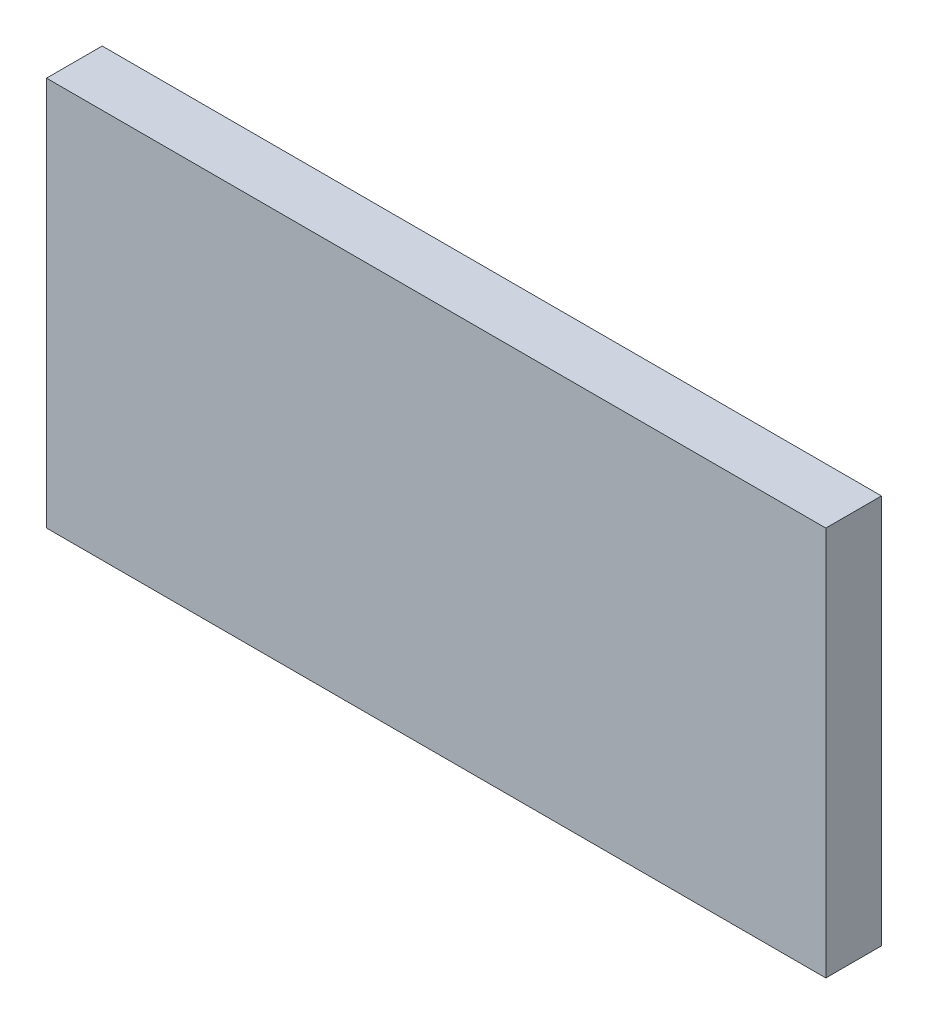
ISO-10303-21;
HEADER;
FILE_DESCRIPTION(('STEP AP214'),'2;1');
FILE_NAME('part.step','',(''),(''),'','','');
FILE_SCHEMA(('AUTOMOTIVE_DESIGN { 1 0 10303 214 1 1 1 1 }'));
ENDSEC;
DATA;
#1=APPLICATION_CONTEXT('core data for automotive mechanical design processes');
#2=APPLICATION_PROTOCOL_DEFINITION('international standard','automotive_design',2000,#1);
#3=PRODUCT_CONTEXT('',#1,'mechanical');
#4=PRODUCT('Part','Part','',(#3));
#5=PRODUCT_RELATED_PRODUCT_CATEGORY('part','',(#4));
#6=PRODUCT_DEFINITION_FORMATION('','',#4);
#7=PRODUCT_DEFINITION_CONTEXT('part definition',#1,'design');
#8=PRODUCT_DEFINITION('design','',#6,#7);
#9=PRODUCT_DEFINITION_SHAPE('','',#8);
#10=(LENGTH_UNIT() NAMED_UNIT(*) SI_UNIT(.MILLI.,.METRE.));
#11=(NAMED_UNIT(*) PLANE_ANGLE_UNIT() SI_UNIT($,.RADIAN.));
#12=(NAMED_UNIT(*) SI_UNIT($,.STERADIAN.) SOLID_ANGLE_UNIT());
#13=UNCERTAINTY_MEASURE_WITH_UNIT(LENGTH_MEASURE(1.E-05),#10,'distance_accuracy_value','');
#14=(GEOMETRIC_REPRESENTATION_CONTEXT(3) GLOBAL_UNCERTAINTY_ASSIGNED_CONTEXT((#13)) GLOBAL_UNIT_ASSIGNED_CONTEXT((#10,
#11,#12)) REPRESENTATION_CONTEXT('',''));
#15=CARTESIAN_POINT('',(0.,0.,0.));
#16=DIRECTION('',(0.,0.,1.));
#17=DIRECTION('',(1.,0.,0.));
#18=AXIS2_PLACEMENT_3D('',#15,#16,#17);
#19=CARTESIAN_POINT('',(-140.,-70.,20.));
#20=DIRECTION('',(1.,0.,0.));
#21=DIRECTION('',(0.,0.,-1.));
#22=AXIS2_PLACEMENT_3D('',#19,#20,#21);
#23=PLANE('',#22);
#24=DIRECTION('',(0.,-1.,0.));
#25=VECTOR('',#24,1.);
#26=CARTESIAN_POINT('',(-140.,-70.,0.));
#27=LINE('',#26,#25);
#28=CARTESIAN_POINT('',(-140.,70.,0.));
#29=VERTEX_POINT('',#28);
#30=CARTESIAN_POINT('',(-140.,-70.,0.));
#31=VERTEX_POINT('',#30);
#32=EDGE_CURVE('E102',#29,#31,#27,.T.);
#33=ORIENTED_EDGE('',*,*,#32,.T.);
#34=DIRECTION('',(0.,0.,-1.));
#35=VECTOR('',#34,1.);
#36=CARTESIAN_POINT('',(-140.,-70.,20.));
#37=LINE('',#36,#35);
#38=CARTESIAN_POINT('',(-140.,-70.,20.));
#39=VERTEX_POINT('',#38);
#40=EDGE_CURVE('E11',#39,#31,#37,.T.);
#41=ORIENTED_EDGE('',*,*,#40,.F.);
#42=DIRECTION('',(0.,-1.,0.));
#43=VECTOR('',#42,1.);
#44=CARTESIAN_POINT('',(-140.,-70.,20.));
#45=LINE('',#44,#43);
#46=CARTESIAN_POINT('',(-140.,70.,20.));
#47=VERTEX_POINT('',#46);
#48=EDGE_CURVE('E90',#47,#39,#45,.T.);
#49=ORIENTED_EDGE('',*,*,#48,.F.);
#50=DIRECTION('',(0.,0.,-1.));
#51=VECTOR('',#50,1.);
#52=CARTESIAN_POINT('',(-140.,70.,20.));
#53=LINE('',#52,#51);
#54=EDGE_CURVE('E98',#47,#29,#53,.T.);
#55=ORIENTED_EDGE('',*,*,#54,.T.);
#56=EDGE_LOOP('',(#33,#41,#49,#55));
#57=FACE_BOUND('',#56,.T.);
#58=ADVANCED_FACE('F39',(#57),#23,.F.);
#59=CARTESIAN_POINT('',(140.,-70.,20.));
#60=DIRECTION('',(0.,1.,0.));
#61=DIRECTION('',(-1.,0.,0.));
#62=AXIS2_PLACEMENT_3D('',#59,#60,#61);
#63=PLANE('',#62);
#64=DIRECTION('',(1.,0.,0.));
#65=VECTOR('',#64,1.);
#66=CARTESIAN_POINT('',(140.,-70.,0.));
#67=LINE('',#66,#65);
#68=CARTESIAN_POINT('',(140.,-70.,0.));
#69=VERTEX_POINT('',#68);
#70=EDGE_CURVE('E94',#31,#69,#67,.T.);
#71=ORIENTED_EDGE('',*,*,#70,.T.);
#72=DIRECTION('',(0.,0.,-1.));
#73=VECTOR('',#72,1.);
#74=CARTESIAN_POINT('',(140.,-70.,20.));
#75=LINE('',#74,#73);
#76=CARTESIAN_POINT('',(140.,-70.,20.));
#77=VERTEX_POINT('',#76);
#78=EDGE_CURVE('E47',#77,#69,#75,.T.);
#79=ORIENTED_EDGE('',*,*,#78,.F.);
#80=DIRECTION('',(1.,0.,0.));
#81=VECTOR('',#80,1.);
#82=CARTESIAN_POINT('',(140.,-70.,20.));
#83=LINE('',#82,#81);
#84=EDGE_CURVE('E85',#39,#77,#83,.T.);
#85=ORIENTED_EDGE('',*,*,#84,.F.);
#86=ORIENTED_EDGE('',*,*,#40,.T.);
#87=EDGE_LOOP('',(#71,#79,#85,#86));
#88=FACE_BOUND('',#87,.T.);
#89=ADVANCED_FACE('F93',(#88),#63,.F.);
#90=CARTESIAN_POINT('',(140.,-70.,20.));
#91=DIRECTION('',(-1.,0.,0.));
#92=DIRECTION('',(0.,0.,1.));
#93=AXIS2_PLACEMENT_3D('',#90,#91,#92);
#94=PLANE('',#93);
#95=DIRECTION('',(0.,1.,0.));
#96=VECTOR('',#95,1.);
#97=CARTESIAN_POINT('',(140.,-70.,0.));
#98=LINE('',#97,#96);
#99=CARTESIAN_POINT('',(140.,70.,0.));
#100=VERTEX_POINT('',#99);
#101=EDGE_CURVE('E72',#69,#100,#98,.T.);
#102=ORIENTED_EDGE('',*,*,#101,.T.);
#103=DIRECTION('',(0.,0.,-1.));
#104=VECTOR('',#103,1.);
#105=CARTESIAN_POINT('',(140.,70.,20.));
#106=LINE('',#105,#104);
#107=CARTESIAN_POINT('',(140.,70.,20.));
#108=VERTEX_POINT('',#107);
#109=EDGE_CURVE('E95',#108,#100,#106,.T.);
#110=ORIENTED_EDGE('',*,*,#109,.F.);
#111=DIRECTION('',(0.,1.,0.));
#112=VECTOR('',#111,1.);
#113=CARTESIAN_POINT('',(140.,-70.,20.));
#114=LINE('',#113,#112);
#115=EDGE_CURVE('E88',#77,#108,#114,.T.);
#116=ORIENTED_EDGE('',*,*,#115,.F.);
#117=ORIENTED_EDGE('',*,*,#78,.T.);
#118=EDGE_LOOP('',(#102,#110,#116,#117));
#119=FACE_BOUND('',#118,.T.);
#120=ADVANCED_FACE('F96',(#119),#94,.F.);
#121=CARTESIAN_POINT('',(140.,70.,20.));
#122=DIRECTION('',(0.,-1.,0.));
#123=DIRECTION('',(1.,0.,0.));
#124=AXIS2_PLACEMENT_3D('',#121,#122,#123);
#125=PLANE('',#124);
#126=DIRECTION('',(-1.,0.,0.));
#127=VECTOR('',#126,1.);
#128=CARTESIAN_POINT('',(140.,70.,0.));
#129=LINE('',#128,#127);
#130=EDGE_CURVE('E78',#100,#29,#129,.T.);
#131=ORIENTED_EDGE('',*,*,#130,.T.);
#132=ORIENTED_EDGE('',*,*,#54,.F.);
#133=DIRECTION('',(-1.,0.,0.));
#134=VECTOR('',#133,1.);
#135=CARTESIAN_POINT('',(140.,70.,20.));
#136=LINE('',#135,#134);
#137=EDGE_CURVE('E55',#108,#47,#136,.T.);
#138=ORIENTED_EDGE('',*,*,#137,.F.);
#139=ORIENTED_EDGE('',*,*,#109,.T.);
#140=EDGE_LOOP('',(#131,#132,#138,#139));
#141=FACE_BOUND('',#140,.T.);
#142=ADVANCED_FACE('F109',(#141),#125,.F.);
#143=CARTESIAN_POINT('',(0.,0.,20.));
#144=DIRECTION('',(0.,0.,1.));
#145=DIRECTION('',(1.,0.,0.));
#146=AXIS2_PLACEMENT_3D('',#143,#144,#145);
#147=PLANE('',#146);
#148=ORIENTED_EDGE('',*,*,#48,.T.);
#149=ORIENTED_EDGE('',*,*,#84,.T.);
#150=ORIENTED_EDGE('',*,*,#115,.T.);
#151=ORIENTED_EDGE('',*,*,#137,.T.);
#152=EDGE_LOOP('',(#148,#149,#150,#151));
#153=FACE_BOUND('',#152,.T.);
#154=ADVANCED_FACE('F86',(#153),#147,.T.);
#155=CARTESIAN_POINT('',(0.,0.,0.));
#156=DIRECTION('',(0.,0.,1.));
#157=DIRECTION('',(1.,0.,0.));
#158=AXIS2_PLACEMENT_3D('',#155,#156,#157);
#159=PLANE('',#158);
#160=ORIENTED_EDGE('',*,*,#32,.F.);
#161=ORIENTED_EDGE('',*,*,#130,.F.);
#162=ORIENTED_EDGE('',*,*,#101,.F.);
#163=ORIENTED_EDGE('',*,*,#70,.F.);
#164=EDGE_LOOP('',(#160,#161,#162,#163));
#165=FACE_BOUND('',#164,.T.);
#166=ADVANCED_FACE('F112',(#165),#159,.F.);
#167=CLOSED_SHELL('',(#58,#89,#120,#142,#154,#166));
#168=MANIFOLD_SOLID_BREP('B2',#167);
#169=ADVANCED_BREP_SHAPE_REPRESENTATION('',(#18,#168),#14);
#170=SHAPE_DEFINITION_REPRESENTATION(#9,#169);
ENDSEC;
END-ISO-10303-21;
